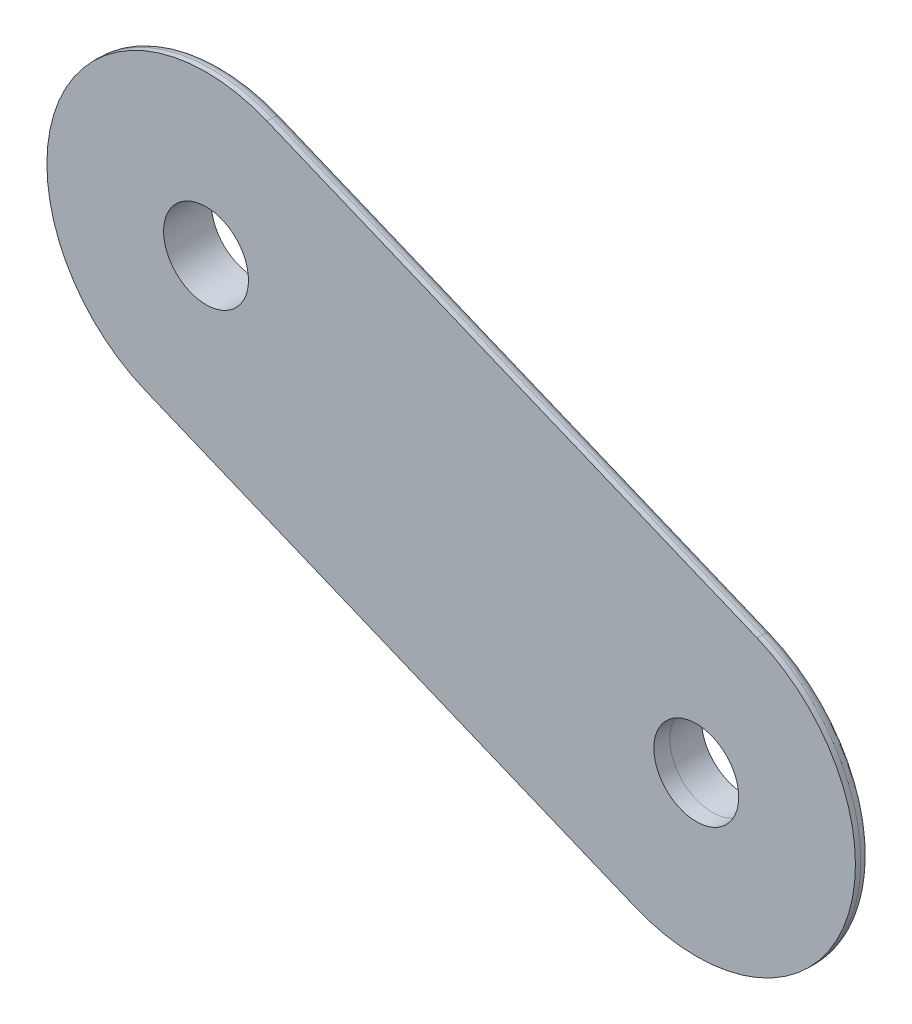
ISO-10303-21;
HEADER;
FILE_DESCRIPTION(('STEP AP214'),'2;1');
FILE_NAME('part.step','',(''),(''),'','','');
FILE_SCHEMA(('AUTOMOTIVE_DESIGN { 1 0 10303 214 1 1 1 1 }'));
ENDSEC;
DATA;
#1=APPLICATION_CONTEXT('core data for automotive mechanical design processes');
#2=APPLICATION_PROTOCOL_DEFINITION('international standard','automotive_design',2000,#1);
#3=PRODUCT_CONTEXT('',#1,'mechanical');
#4=PRODUCT('Part','Part','',(#3));
#5=PRODUCT_RELATED_PRODUCT_CATEGORY('part','',(#4));
#6=PRODUCT_DEFINITION_FORMATION('','',#4);
#7=PRODUCT_DEFINITION_CONTEXT('part definition',#1,'design');
#8=PRODUCT_DEFINITION('design','',#6,#7);
#9=PRODUCT_DEFINITION_SHAPE('','',#8);
#10=(LENGTH_UNIT() NAMED_UNIT(*) SI_UNIT(.MILLI.,.METRE.));
#11=(NAMED_UNIT(*) PLANE_ANGLE_UNIT() SI_UNIT($,.RADIAN.));
#12=(NAMED_UNIT(*) SI_UNIT($,.STERADIAN.) SOLID_ANGLE_UNIT());
#13=UNCERTAINTY_MEASURE_WITH_UNIT(LENGTH_MEASURE(1.E-05),#10,'distance_accuracy_value','');
#14=(GEOMETRIC_REPRESENTATION_CONTEXT(3) GLOBAL_UNCERTAINTY_ASSIGNED_CONTEXT((#13)) GLOBAL_UNIT_ASSIGNED_CONTEXT((#10,
#11,#12)) REPRESENTATION_CONTEXT('',''));
#15=CARTESIAN_POINT('',(0.,0.,0.));
#16=DIRECTION('',(0.,0.,1.));
#17=DIRECTION('',(1.,0.,0.));
#18=AXIS2_PLACEMENT_3D('',#15,#16,#17);
#19=CARTESIAN_POINT('',(46.2112296368152,-19.0924659343297,3.));
#20=DIRECTION('',(0.,0.,-1.));
#21=DIRECTION('',(-1.,0.,0.));
#22=AXIS2_PLACEMENT_3D('',#19,#20,#21);
#23=PLANE('',#22);
#24=CARTESIAN_POINT('',(46.2112296368152,-19.0924659343297,3.));
#25=DIRECTION('',(0.,0.,1.));
#26=DIRECTION('',(-1.,0.,0.));
#27=AXIS2_PLACEMENT_3D('',#24,#25,#26);
#28=CIRCLE('',#27,7.5);
#29=CARTESIAN_POINT('',(38.7112296368152,-19.0924659343297,3.));
#30=VERTEX_POINT('',#29);
#31=EDGE_CURVE('E66',#30,#30,#28,.T.);
#32=ORIENTED_EDGE('',*,*,#31,.T.);
#33=EDGE_LOOP('',(#32));
#34=FACE_BOUND('',#33,.T.);
#35=CARTESIAN_POINT('',(46.2112296368152,-19.0924659343297,3.));
#36=DIRECTION('',(0.,0.,1.));
#37=DIRECTION('',(-1.,0.,0.));
#38=AXIS2_PLACEMENT_3D('',#35,#36,#37);
#39=CIRCLE('',#38,4.);
#40=CARTESIAN_POINT('',(42.2112296368152,-19.0924659343297,3.));
#41=VERTEX_POINT('',#40);
#42=EDGE_CURVE('E57',#41,#41,#39,.T.);
#43=ORIENTED_EDGE('',*,*,#42,.F.);
#44=EDGE_LOOP('',(#43));
#45=FACE_BOUND('',#44,.T.);
#46=ADVANCED_FACE('F53',(#34,#45),#23,.F.);
#47=CARTESIAN_POINT('',(46.2112296368152,-19.0924659343297,0.));
#48=DIRECTION('',(0.,0.,-1.));
#49=DIRECTION('',(-1.,0.,0.));
#50=AXIS2_PLACEMENT_3D('',#47,#48,#49);
#51=PLANE('',#50);
#52=CARTESIAN_POINT('',(46.2112296368152,-19.0924659343297,0.));
#53=DIRECTION('',(0.,0.,1.));
#54=DIRECTION('',(-1.,0.,0.));
#55=AXIS2_PLACEMENT_3D('',#52,#53,#54);
#56=CIRCLE('',#55,7.5);
#57=CARTESIAN_POINT('',(38.7112296368152,-19.0924659343297,0.));
#58=VERTEX_POINT('',#57);
#59=EDGE_CURVE('E64',#58,#58,#56,.T.);
#60=ORIENTED_EDGE('',*,*,#59,.F.);
#61=EDGE_LOOP('',(#60));
#62=FACE_BOUND('',#61,.T.);
#63=CARTESIAN_POINT('',(46.2112296368152,-19.0924659343297,0.));
#64=DIRECTION('',(0.,0.,1.));
#65=DIRECTION('',(-1.,0.,0.));
#66=AXIS2_PLACEMENT_3D('',#63,#64,#65);
#67=CIRCLE('',#66,4.);
#68=CARTESIAN_POINT('',(42.2112296368152,-19.0924659343297,0.));
#69=VERTEX_POINT('',#68);
#70=EDGE_CURVE('E11',#69,#69,#67,.T.);
#71=ORIENTED_EDGE('',*,*,#70,.T.);
#72=EDGE_LOOP('',(#71));
#73=FACE_BOUND('',#72,.T.);
#74=ADVANCED_FACE('F74',(#62,#73),#51,.T.);
#75=CARTESIAN_POINT('',(46.2112296368152,-19.0924659343297,3.));
#76=DIRECTION('',(0.,0.,-1.));
#77=DIRECTION('',(-1.,0.,0.));
#78=AXIS2_PLACEMENT_3D('',#75,#76,#77);
#79=CYLINDRICAL_SURFACE('',#78,7.5);
#80=ORIENTED_EDGE('',*,*,#31,.F.);
#81=EDGE_LOOP('',(#80));
#82=FACE_BOUND('',#81,.T.);
#83=ORIENTED_EDGE('',*,*,#59,.T.);
#84=EDGE_LOOP('',(#83));
#85=FACE_BOUND('',#84,.T.);
#86=ADVANCED_FACE('F72',(#82,#85),#79,.T.);
#87=CARTESIAN_POINT('',(46.2112296368152,-19.0924659343297,3.));
#88=DIRECTION('',(0.,0.,-1.));
#89=DIRECTION('',(-1.,0.,0.));
#90=AXIS2_PLACEMENT_3D('',#87,#88,#89);
#91=CYLINDRICAL_SURFACE('',#90,4.);
#92=ORIENTED_EDGE('',*,*,#42,.T.);
#93=EDGE_LOOP('',(#92));
#94=FACE_BOUND('',#93,.T.);
#95=ORIENTED_EDGE('',*,*,#70,.F.);
#96=EDGE_LOOP('',(#95));
#97=FACE_BOUND('',#96,.T.);
#98=ADVANCED_FACE('F55',(#94,#97),#91,.F.);
#99=CLOSED_SHELL('',(#46,#74,#86,#98));
#100=MANIFOLD_SOLID_BREP('B2',#99);
#101=CARTESIAN_POINT('',(0.,0.,0.));
#102=DIRECTION('',(0.,0.,1.));
#103=DIRECTION('',(1.,0.,0.));
#104=AXIS2_PLACEMENT_3D('',#101,#102,#103);
#105=PLANE('',#104);
#106=CARTESIAN_POINT('',(0.,0.,0.));
#107=DIRECTION('',(0.,0.,1.));
#108=DIRECTION('',(1.,0.,0.));
#109=AXIS2_PLACEMENT_3D('',#106,#107,#108);
#110=CIRCLE('',#109,7.5);
#111=CARTESIAN_POINT('',(7.5,0.,0.));
#112=VERTEX_POINT('',#111);
#113=EDGE_CURVE('E201',#112,#112,#110,.T.);
#114=ORIENTED_EDGE('',*,*,#113,.F.);
#115=EDGE_LOOP('',(#114));
#116=FACE_BOUND('',#115,.T.);
#117=CARTESIAN_POINT('',(0.,0.,0.));
#118=DIRECTION('',(0.,0.,1.));
#119=DIRECTION('',(1.,0.,0.));
#120=AXIS2_PLACEMENT_3D('',#117,#118,#119);
#121=CIRCLE('',#120,4.);
#122=CARTESIAN_POINT('',(4.,0.,0.));
#123=VERTEX_POINT('',#122);
#124=EDGE_CURVE('E196',#123,#123,#121,.T.);
#125=ORIENTED_EDGE('',*,*,#124,.T.);
#126=EDGE_LOOP('',(#125));
#127=FACE_BOUND('',#126,.T.);
#128=ADVANCED_FACE('F115',(#116,#127),#105,.F.);
#129=CARTESIAN_POINT('',(0.,0.,3.));
#130=DIRECTION('',(0.,0.,-1.));
#131=DIRECTION('',(-1.,0.,0.));
#132=AXIS2_PLACEMENT_3D('',#129,#130,#131);
#133=CYLINDRICAL_SURFACE('',#132,7.5);
#134=CARTESIAN_POINT('',(0.,0.,3.));
#135=DIRECTION('',(0.,0.,1.));
#136=DIRECTION('',(1.,0.,0.));
#137=AXIS2_PLACEMENT_3D('',#134,#135,#136);
#138=CIRCLE('',#137,7.5);
#139=CARTESIAN_POINT('',(7.5,0.,3.));
#140=VERTEX_POINT('',#139);
#141=EDGE_CURVE('E207',#140,#140,#138,.T.);
#142=ORIENTED_EDGE('',*,*,#141,.F.);
#143=EDGE_LOOP('',(#142));
#144=FACE_BOUND('',#143,.T.);
#145=ORIENTED_EDGE('',*,*,#113,.T.);
#146=EDGE_LOOP('',(#145));
#147=FACE_BOUND('',#146,.T.);
#148=ADVANCED_FACE('F291',(#144,#147),#133,.T.);
#149=CARTESIAN_POINT('',(0.,0.,3.));
#150=DIRECTION('',(0.,0.,-1.));
#151=DIRECTION('',(-1.,0.,0.));
#152=AXIS2_PLACEMENT_3D('',#149,#150,#151);
#153=CYLINDRICAL_SURFACE('',#152,4.);
#154=ORIENTED_EDGE('',*,*,#124,.F.);
#155=EDGE_LOOP('',(#154));
#156=FACE_BOUND('',#155,.T.);
#157=CARTESIAN_POINT('',(0.,0.,4.5));
#158=DIRECTION('',(0.,0.,1.));
#159=DIRECTION('',(1.,0.,0.));
#160=AXIS2_PLACEMENT_3D('',#157,#158,#159);
#161=CIRCLE('',#160,4.);
#162=CARTESIAN_POINT('',(4.,0.,4.5));
#163=VERTEX_POINT('',#162);
#164=EDGE_CURVE('E189',#163,#163,#161,.T.);
#165=ORIENTED_EDGE('',*,*,#164,.T.);
#166=EDGE_LOOP('',(#165));
#167=FACE_BOUND('',#166,.T.);
#168=ADVANCED_FACE('F297',(#156,#167),#153,.F.);
#169=CARTESIAN_POINT('',(0.,0.,4.5));
#170=DIRECTION('',(0.,0.,1.));
#171=DIRECTION('',(1.,0.,0.));
#172=AXIS2_PLACEMENT_3D('',#169,#170,#171);
#173=PLANE('',#172);
#174=ORIENTED_EDGE('',*,*,#164,.F.);
#175=EDGE_LOOP('',(#174));
#176=FACE_BOUND('',#175,.T.);
#177=CARTESIAN_POINT('',(0.,0.,4.5));
#178=DIRECTION('',(0.,0.,1.));
#179=DIRECTION('',(1.,0.,0.));
#180=AXIS2_PLACEMENT_3D('',#177,#178,#179);
#181=CIRCLE('',#180,15.);
#182=CARTESIAN_POINT('',(5.7277397802989,13.8633688910445,4.5));
#183=VERTEX_POINT('',#182);
#184=CARTESIAN_POINT('',(-5.7277397802989,-13.8633688910445,4.5));
#185=VERTEX_POINT('',#184);
#186=EDGE_CURVE('E178',#183,#185,#181,.T.);
#187=ORIENTED_EDGE('',*,*,#186,.T.);
#188=DIRECTION('',(0.924224592736303,-0.381849318686593,0.));
#189=VECTOR('',#188,1.);
#190=CARTESIAN_POINT('',(-5.7277397802989,-13.8633688910445,4.5));
#191=LINE('',#190,#189);
#192=CARTESIAN_POINT('',(40.4834898565163,-32.9558348253742,4.5));
#193=VERTEX_POINT('',#192);
#194=EDGE_CURVE('E168',#185,#193,#191,.T.);
#195=ORIENTED_EDGE('',*,*,#194,.T.);
#196=CARTESIAN_POINT('',(46.2112296368152,-19.0924659343297,4.5));
#197=DIRECTION('',(0.,0.,1.));
#198=DIRECTION('',(-1.,0.,0.));
#199=AXIS2_PLACEMENT_3D('',#196,#197,#198);
#200=CIRCLE('',#199,15.);
#201=CARTESIAN_POINT('',(51.9389694171141,-5.22909704328515,4.5));
#202=VERTEX_POINT('',#201);
#203=EDGE_CURVE('E177',#193,#202,#200,.T.);
#204=ORIENTED_EDGE('',*,*,#203,.T.);
#205=DIRECTION('',(-0.924224592736303,0.381849318686593,0.));
#206=VECTOR('',#205,1.);
#207=CARTESIAN_POINT('',(5.7277397802989,13.8633688910445,4.5));
#208=LINE('',#207,#206);
#209=EDGE_CURVE('E184',#202,#183,#208,.T.);
#210=ORIENTED_EDGE('',*,*,#209,.T.);
#211=EDGE_LOOP('',(#187,#195,#204,#210));
#212=FACE_BOUND('',#211,.T.);
#213=CARTESIAN_POINT('',(46.2112296368152,-19.0924659343297,4.5));
#214=DIRECTION('',(0.,0.,1.));
#215=DIRECTION('',(-1.,0.,0.));
#216=AXIS2_PLACEMENT_3D('',#213,#214,#215);
#217=CIRCLE('',#216,3.99999999999999);
#218=CARTESIAN_POINT('',(42.2112296368152,-19.0924659343297,4.5));
#219=VERTEX_POINT('',#218);
#220=EDGE_CURVE('E254',#219,#219,#217,.T.);
#221=ORIENTED_EDGE('',*,*,#220,.F.);
#222=EDGE_LOOP('',(#221));
#223=FACE_BOUND('',#222,.T.);
#224=ADVANCED_FACE('F181',(#176,#212,#223),#173,.T.);
#225=CARTESIAN_POINT('',(0.,0.,3.));
#226=DIRECTION('',(0.,0.,1.));
#227=DIRECTION('',(1.,0.,0.));
#228=AXIS2_PLACEMENT_3D('',#225,#226,#227);
#229=PLANE('',#228);
#230=DIRECTION('',(0.924224592736303,-0.381849318686593,0.));
#231=VECTOR('',#230,1.);
#232=CARTESIAN_POINT('',(-5.3458904616123,-12.9391442983082,3.));
#233=LINE('',#232,#231);
#234=CARTESIAN_POINT('',(40.8653391752029,-32.0316102326379,3.));
#235=VERTEX_POINT('',#234);
#236=CARTESIAN_POINT('',(-5.34589046161231,-12.9391442983082,3.));
#237=VERTEX_POINT('',#236);
#238=EDGE_CURVE('E216',#235,#237,#233,.F.);
#239=ORIENTED_EDGE('',*,*,#238,.T.);
#240=CARTESIAN_POINT('',(0.,0.,3.));
#241=DIRECTION('',(0.,0.,1.));
#242=DIRECTION('',(1.,0.,0.));
#243=AXIS2_PLACEMENT_3D('',#240,#241,#242);
#244=CIRCLE('',#243,14.);
#245=CARTESIAN_POINT('',(5.34589046161231,12.9391442983082,3.));
#246=VERTEX_POINT('',#245);
#247=EDGE_CURVE('E225',#237,#246,#244,.F.);
#248=ORIENTED_EDGE('',*,*,#247,.T.);
#249=DIRECTION('',(-0.924224592736303,0.381849318686594,0.));
#250=VECTOR('',#249,1.);
#251=CARTESIAN_POINT('',(5.34589046161231,12.9391442983082,3.));
#252=LINE('',#251,#250);
#253=CARTESIAN_POINT('',(51.5571200984275,-6.15332163602146,3.));
#254=VERTEX_POINT('',#253);
#255=EDGE_CURVE('E222',#246,#254,#252,.F.);
#256=ORIENTED_EDGE('',*,*,#255,.T.);
#257=CARTESIAN_POINT('',(46.2112296368152,-19.0924659343297,3.));
#258=DIRECTION('',(0.,0.,1.));
#259=DIRECTION('',(1.,0.,0.));
#260=AXIS2_PLACEMENT_3D('',#257,#258,#259);
#261=CIRCLE('',#260,14.);
#262=EDGE_CURVE('E219',#254,#235,#261,.F.);
#263=ORIENTED_EDGE('',*,*,#262,.T.);
#264=EDGE_LOOP('',(#239,#248,#256,#263));
#265=FACE_BOUND('',#264,.T.);
#266=ORIENTED_EDGE('',*,*,#141,.T.);
#267=EDGE_LOOP('',(#266));
#268=FACE_BOUND('',#267,.T.);
#269=CARTESIAN_POINT('',(46.2112296368152,-19.0924659343297,3.));
#270=DIRECTION('',(0.,0.,1.));
#271=DIRECTION('',(-1.,0.,0.));
#272=AXIS2_PLACEMENT_3D('',#269,#270,#271);
#273=CIRCLE('',#272,3.99999999999999);
#274=CARTESIAN_POINT('',(42.2112296368152,-19.0924659343297,3.));
#275=VERTEX_POINT('',#274);
#276=EDGE_CURVE('E247',#275,#275,#273,.T.);
#277=ORIENTED_EDGE('',*,*,#276,.T.);
#278=EDGE_LOOP('',(#277));
#279=FACE_BOUND('',#278,.T.);
#280=ADVANCED_FACE('F308',(#265,#268,#279),#229,.F.);
#281=CARTESIAN_POINT('',(0.,0.,4.5));
#282=DIRECTION('',(0.,0.,-1.));
#283=DIRECTION('',(-1.,0.,0.));
#284=AXIS2_PLACEMENT_3D('',#281,#282,#283);
#285=CYLINDRICAL_SURFACE('',#284,15.);
#286=DIRECTION('',(0.,0.,-1.));
#287=VECTOR('',#286,1.);
#288=CARTESIAN_POINT('',(5.7277397802989,13.8633688910445,4.5));
#289=LINE('',#288,#287);
#290=CARTESIAN_POINT('',(5.7277397802989,13.8633688910445,4.));
#291=VERTEX_POINT('',#290);
#292=EDGE_CURVE('E269',#183,#291,#289,.T.);
#293=ORIENTED_EDGE('',*,*,#292,.T.);
#294=CARTESIAN_POINT('',(0.,0.,4.));
#295=DIRECTION('',(0.,0.,1.));
#296=DIRECTION('',(1.,0.,0.));
#297=AXIS2_PLACEMENT_3D('',#294,#295,#296);
#298=CIRCLE('',#297,15.);
#299=CARTESIAN_POINT('',(-5.7277397802989,-13.8633688910445,4.));
#300=VERTEX_POINT('',#299);
#301=EDGE_CURVE('E194',#291,#300,#298,.T.);
#302=ORIENTED_EDGE('',*,*,#301,.T.);
#303=DIRECTION('',(0.,0.,-1.));
#304=VECTOR('',#303,1.);
#305=CARTESIAN_POINT('',(-5.7277397802989,-13.8633688910445,4.5));
#306=LINE('',#305,#304);
#307=EDGE_CURVE('E172',#185,#300,#306,.T.);
#308=ORIENTED_EDGE('',*,*,#307,.F.);
#309=ORIENTED_EDGE('',*,*,#186,.F.);
#310=EDGE_LOOP('',(#293,#302,#308,#309));
#311=FACE_BOUND('',#310,.T.);
#312=ADVANCED_FACE('F192',(#311),#285,.T.);
#313=CARTESIAN_POINT('',(-5.7277397802989,-13.8633688910445,4.5));
#314=DIRECTION('',(0.381849318686593,0.924224592736303,0.));
#315=DIRECTION('',(-0.924224592736303,0.381849318686593,0.));
#316=AXIS2_PLACEMENT_3D('',#313,#314,#315);
#317=PLANE('',#316);
#318=ORIENTED_EDGE('',*,*,#307,.T.);
#319=DIRECTION('',(0.924224592736303,-0.381849318686593,0.));
#320=VECTOR('',#319,1.);
#321=CARTESIAN_POINT('',(-5.7277397802989,-13.8633688910445,4.));
#322=LINE('',#321,#320);
#323=CARTESIAN_POINT('',(40.4834898565163,-32.9558348253742,4.));
#324=VERTEX_POINT('',#323);
#325=EDGE_CURVE('E51',#300,#324,#322,.T.);
#326=ORIENTED_EDGE('',*,*,#325,.T.);
#327=DIRECTION('',(0.,0.,-1.));
#328=VECTOR('',#327,1.);
#329=CARTESIAN_POINT('',(40.4834898565163,-32.9558348253742,4.5));
#330=LINE('',#329,#328);
#331=EDGE_CURVE('E173',#193,#324,#330,.T.);
#332=ORIENTED_EDGE('',*,*,#331,.F.);
#333=ORIENTED_EDGE('',*,*,#194,.F.);
#334=EDGE_LOOP('',(#318,#326,#332,#333));
#335=FACE_BOUND('',#334,.T.);
#336=ADVANCED_FACE('F170',(#335),#317,.F.);
#337=CARTESIAN_POINT('',(46.2112296368152,-19.0924659343297,4.5));
#338=DIRECTION('',(0.,0.,-1.));
#339=DIRECTION('',(-1.,0.,0.));
#340=AXIS2_PLACEMENT_3D('',#337,#338,#339);
#341=CYLINDRICAL_SURFACE('',#340,15.);
#342=ORIENTED_EDGE('',*,*,#331,.T.);
#343=CARTESIAN_POINT('',(46.2112296368152,-19.0924659343297,4.));
#344=DIRECTION('',(0.,0.,1.));
#345=DIRECTION('',(1.,0.,0.));
#346=AXIS2_PLACEMENT_3D('',#343,#344,#345);
#347=CIRCLE('',#346,15.);
#348=CARTESIAN_POINT('',(51.9389694171141,-5.22909704328515,4.));
#349=VERTEX_POINT('',#348);
#350=EDGE_CURVE('E125',#324,#349,#347,.T.);
#351=ORIENTED_EDGE('',*,*,#350,.T.);
#352=DIRECTION('',(0.,0.,-1.));
#353=VECTOR('',#352,1.);
#354=CARTESIAN_POINT('',(51.9389694171141,-5.22909704328515,4.5));
#355=LINE('',#354,#353);
#356=EDGE_CURVE('E203',#202,#349,#355,.T.);
#357=ORIENTED_EDGE('',*,*,#356,.F.);
#358=ORIENTED_EDGE('',*,*,#203,.F.);
#359=EDGE_LOOP('',(#342,#351,#357,#358));
#360=FACE_BOUND('',#359,.T.);
#361=ADVANCED_FACE('F311',(#360),#341,.T.);
#362=CARTESIAN_POINT('',(5.7277397802989,13.8633688910445,4.5));
#363=DIRECTION('',(-0.381849318686593,-0.924224592736303,0.));
#364=DIRECTION('',(0.924224592736303,-0.381849318686594,0.));
#365=AXIS2_PLACEMENT_3D('',#362,#363,#364);
#366=PLANE('',#365);
#367=ORIENTED_EDGE('',*,*,#356,.T.);
#368=DIRECTION('',(-0.924224592736303,0.381849318686594,0.));
#369=VECTOR('',#368,1.);
#370=CARTESIAN_POINT('',(5.7277397802989,13.8633688910445,4.));
#371=LINE('',#370,#369);
#372=EDGE_CURVE('E229',#349,#291,#371,.T.);
#373=ORIENTED_EDGE('',*,*,#372,.T.);
#374=ORIENTED_EDGE('',*,*,#292,.F.);
#375=ORIENTED_EDGE('',*,*,#209,.F.);
#376=EDGE_LOOP('',(#367,#373,#374,#375));
#377=FACE_BOUND('',#376,.T.);
#378=ADVANCED_FACE('F273',(#377),#366,.F.);
#379=CARTESIAN_POINT('',(46.2112296368152,-19.0924659343297,4.5));
#380=DIRECTION('',(0.,0.,-1.));
#381=DIRECTION('',(-1.,0.,0.));
#382=AXIS2_PLACEMENT_3D('',#379,#380,#381);
#383=CYLINDRICAL_SURFACE('',#382,3.99999999999999);
#384=ORIENTED_EDGE('',*,*,#220,.T.);
#385=EDGE_LOOP('',(#384));
#386=FACE_BOUND('',#385,.T.);
#387=ORIENTED_EDGE('',*,*,#276,.F.);
#388=EDGE_LOOP('',(#387));
#389=FACE_BOUND('',#388,.T.);
#390=ADVANCED_FACE('F316',(#386,#389),#383,.F.);
#391=CARTESIAN_POINT('',(46.2112296368152,-19.0924659343297,4.));
#392=DIRECTION('',(0.,0.,1.));
#393=DIRECTION('',(1.,0.,0.));
#394=AXIS2_PLACEMENT_3D('',#391,#392,#393);
#395=TOROIDAL_SURFACE('',#394,14.,1.);
#396=CARTESIAN_POINT('',(40.8653391752029,-32.0316102326379,4.));
#397=DIRECTION('',(-0.924224592736302,0.381849318686596,0.));
#398=DIRECTION('',(-0.381849318686596,-0.924224592736302,0.));
#399=AXIS2_PLACEMENT_3D('',#396,#397,#398);
#400=CIRCLE('',#399,1.);
#401=EDGE_CURVE('E239',#235,#324,#400,.T.);
#402=ORIENTED_EDGE('',*,*,#401,.F.);
#403=ORIENTED_EDGE('',*,*,#262,.F.);
#404=CARTESIAN_POINT('',(51.5571200984275,-6.15332163602146,4.));
#405=DIRECTION('',(-0.924224592736302,0.381849318686594,0.));
#406=DIRECTION('',(-0.381849318686594,-0.924224592736302,0.));
#407=AXIS2_PLACEMENT_3D('',#404,#405,#406);
#408=CIRCLE('',#407,1.);
#409=EDGE_CURVE('E119',#349,#254,#408,.T.);
#410=ORIENTED_EDGE('',*,*,#409,.F.);
#411=ORIENTED_EDGE('',*,*,#350,.F.);
#412=EDGE_LOOP('',(#402,#403,#410,#411));
#413=FACE_BOUND('',#412,.T.);
#414=ADVANCED_FACE('F117',(#413),#395,.T.);
#415=CARTESIAN_POINT('',(5.34589046161231,12.9391442983082,4.));
#416=DIRECTION('',(-0.924224592736303,0.381849318686594,0.));
#417=DIRECTION('',(-0.381849318686593,-0.924224592736303,0.));
#418=AXIS2_PLACEMENT_3D('',#415,#416,#417);
#419=CYLINDRICAL_SURFACE('',#418,1.);
#420=ORIENTED_EDGE('',*,*,#409,.T.);
#421=ORIENTED_EDGE('',*,*,#255,.F.);
#422=CARTESIAN_POINT('',(5.34589046161231,12.9391442983082,4.));
#423=DIRECTION('',(-0.924224592736303,0.381849318686594,0.));
#424=DIRECTION('',(-0.381849318686594,-0.924224592736303,0.));
#425=AXIS2_PLACEMENT_3D('',#422,#423,#424);
#426=CIRCLE('',#425,1.);
#427=EDGE_CURVE('E237',#291,#246,#426,.T.);
#428=ORIENTED_EDGE('',*,*,#427,.F.);
#429=ORIENTED_EDGE('',*,*,#372,.F.);
#430=EDGE_LOOP('',(#420,#421,#428,#429));
#431=FACE_BOUND('',#430,.T.);
#432=ADVANCED_FACE('F277',(#431),#419,.T.);
#433=CARTESIAN_POINT('',(-5.34589046161231,-12.9391442983082,4.));
#434=DIRECTION('',(0.924224592736303,-0.381849318686593,0.));
#435=DIRECTION('',(0.381849318686593,0.924224592736303,0.));
#436=AXIS2_PLACEMENT_3D('',#433,#434,#435);
#437=CYLINDRICAL_SURFACE('',#436,1.);
#438=ORIENTED_EDGE('',*,*,#401,.T.);
#439=ORIENTED_EDGE('',*,*,#325,.F.);
#440=CARTESIAN_POINT('',(-5.34589046161231,-12.9391442983082,4.));
#441=DIRECTION('',(-0.924224592736303,0.381849318686593,0.));
#442=DIRECTION('',(-0.381849318686593,-0.924224592736303,0.));
#443=AXIS2_PLACEMENT_3D('',#440,#441,#442);
#444=CIRCLE('',#443,1.);
#445=EDGE_CURVE('E234',#237,#300,#444,.T.);
#446=ORIENTED_EDGE('',*,*,#445,.F.);
#447=ORIENTED_EDGE('',*,*,#238,.F.);
#448=EDGE_LOOP('',(#438,#439,#446,#447));
#449=FACE_BOUND('',#448,.T.);
#450=ADVANCED_FACE('F282',(#449),#437,.T.);
#451=CARTESIAN_POINT('',(0.,0.,4.));
#452=DIRECTION('',(0.,0.,1.));
#453=DIRECTION('',(1.,0.,0.));
#454=AXIS2_PLACEMENT_3D('',#451,#452,#453);
#455=TOROIDAL_SURFACE('',#454,14.,1.);
#456=ORIENTED_EDGE('',*,*,#427,.T.);
#457=ORIENTED_EDGE('',*,*,#247,.F.);
#458=ORIENTED_EDGE('',*,*,#445,.T.);
#459=ORIENTED_EDGE('',*,*,#301,.F.);
#460=EDGE_LOOP('',(#456,#457,#458,#459));
#461=FACE_BOUND('',#460,.T.);
#462=ADVANCED_FACE('F280',(#461),#455,.T.);
#463=CLOSED_SHELL('',(#128,#148,#168,#224,#280,#312,#336,#361,#378,#390,#414,#432,#450,#462));
#464=MANIFOLD_SOLID_BREP('B6',#463);
#465=ADVANCED_BREP_SHAPE_REPRESENTATION('',(#18,#100,#464),#14);
#466=SHAPE_DEFINITION_REPRESENTATION(#9,#465);
ENDSEC;
END-ISO-10303-21;
